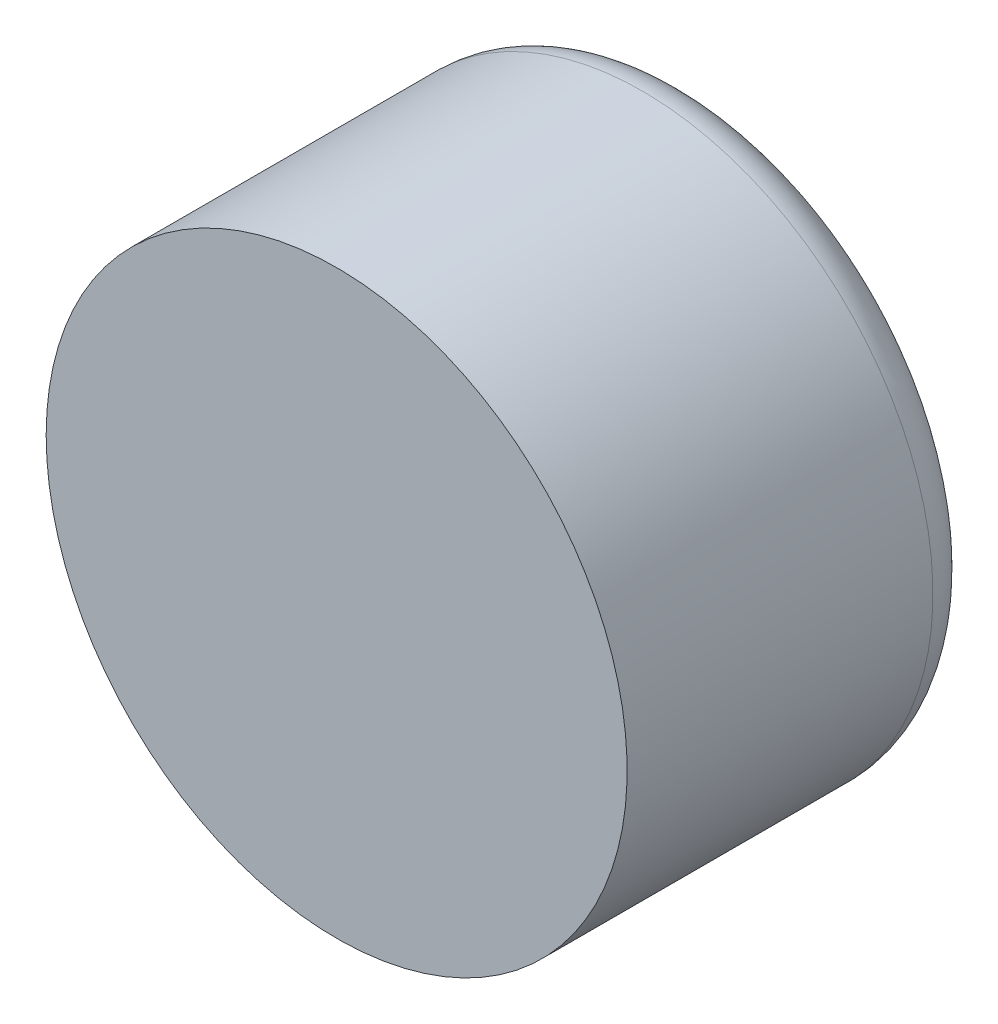
ISO-10303-21;
HEADER;
FILE_DESCRIPTION(('STEP AP214'),'2;1');
FILE_NAME('part.step','',(''),(''),'','','');
FILE_SCHEMA(('AUTOMOTIVE_DESIGN { 1 0 10303 214 1 1 1 1 }'));
ENDSEC;
DATA;
#1=APPLICATION_CONTEXT('core data for automotive mechanical design processes');
#2=APPLICATION_PROTOCOL_DEFINITION('international standard','automotive_design',2000,#1);
#3=PRODUCT_CONTEXT('',#1,'mechanical');
#4=PRODUCT('Part','Part','',(#3));
#5=PRODUCT_RELATED_PRODUCT_CATEGORY('part','',(#4));
#6=PRODUCT_DEFINITION_FORMATION('','',#4);
#7=PRODUCT_DEFINITION_CONTEXT('part definition',#1,'design');
#8=PRODUCT_DEFINITION('design','',#6,#7);
#9=PRODUCT_DEFINITION_SHAPE('','',#8);
#10=(LENGTH_UNIT() NAMED_UNIT(*) SI_UNIT(.MILLI.,.METRE.));
#11=(NAMED_UNIT(*) PLANE_ANGLE_UNIT() SI_UNIT($,.RADIAN.));
#12=(NAMED_UNIT(*) SI_UNIT($,.STERADIAN.) SOLID_ANGLE_UNIT());
#13=UNCERTAINTY_MEASURE_WITH_UNIT(LENGTH_MEASURE(1.E-05),#10,'distance_accuracy_value','');
#14=(GEOMETRIC_REPRESENTATION_CONTEXT(3) GLOBAL_UNCERTAINTY_ASSIGNED_CONTEXT((#13)) GLOBAL_UNIT_ASSIGNED_CONTEXT((#10,
#11,#12)) REPRESENTATION_CONTEXT('',''));
#15=CARTESIAN_POINT('',(0.,0.,0.));
#16=DIRECTION('',(0.,0.,1.));
#17=DIRECTION('',(1.,0.,0.));
#18=AXIS2_PLACEMENT_3D('',#15,#16,#17);
#19=CARTESIAN_POINT('',(3.82033071844035E-09,-9.72969439461125E-07,-9.1));
#20=DIRECTION('',(0.,0.,-1.));
#21=DIRECTION('',(1.,0.,0.));
#22=AXIS2_PLACEMENT_3D('',#19,#20,#21);
#23=TOROIDAL_SURFACE('',#22,1.6,0.3);
#24=CARTESIAN_POINT('',(3.82033071844035E-09,-9.72969439461125E-07,-9.1));
#25=DIRECTION('',(0.,0.,-1.));
#26=DIRECTION('',(-1.,0.,0.));
#27=AXIS2_PLACEMENT_3D('',#24,#25,#26);
#28=CIRCLE('',#27,1.9);
#29=CARTESIAN_POINT('',(-1.89999999617967,-9.72969439693808E-07,-9.1));
#30=VERTEX_POINT('',#29);
#31=EDGE_CURVE('E240',#30,#30,#28,.T.);
#32=ORIENTED_EDGE('',*,*,#31,.T.);
#33=EDGE_LOOP('',(#32));
#34=FACE_BOUND('',#33,.T.);
#35=CARTESIAN_POINT('',(3.82033071844035E-09,-9.72969439461125E-07,-9.4));
#36=DIRECTION('',(0.,0.,1.));
#37=DIRECTION('',(-1.,0.,0.));
#38=AXIS2_PLACEMENT_3D('',#35,#36,#37);
#39=CIRCLE('',#38,1.6);
#40=CARTESIAN_POINT('',(-1.59999999617967,-9.72969439657069E-07,-9.4));
#41=VERTEX_POINT('',#40);
#42=EDGE_CURVE('E11',#41,#41,#39,.T.);
#43=ORIENTED_EDGE('',*,*,#42,.T.);
#44=EDGE_LOOP('',(#43));
#45=FACE_BOUND('',#44,.T.);
#46=ADVANCED_FACE('F17',(#34,#45),#23,.T.);
#47=CARTESIAN_POINT('',(3.82033071844035E-09,-9.72969439461125E-07,-9.4));
#48=DIRECTION('',(0.,0.,1.));
#49=DIRECTION('',(0.,-1.,0.));
#50=AXIS2_PLACEMENT_3D('',#47,#48,#49);
#51=PLANE('',#50);
#52=DIRECTION('',(-0.866025403784438,0.5,0.));
#53=VECTOR('',#52,1.);
#54=CARTESIAN_POINT('',(-0.79999999617967,-0.808291349834916,-9.4));
#55=LINE('',#54,#53);
#56=CARTESIAN_POINT('',(3.8203294862126E-09,-1.27017156518662,-9.4));
#57=VERTEX_POINT('',#56);
#58=CARTESIAN_POINT('',(-1.09999999617967,-0.635086269078028,-9.4));
#59=VERTEX_POINT('',#58);
#60=EDGE_CURVE('E25',#57,#59,#55,.T.);
#61=ORIENTED_EDGE('',*,*,#60,.F.);
#62=DIRECTION('',(-0.866025403784439,-0.5,0.));
#63=VECTOR('',#62,1.);
#64=CARTESIAN_POINT('',(0.30000000382033,-1.09696648442973,-9.4));
#65=LINE('',#64,#63);
#66=CARTESIAN_POINT('',(1.10000000382033,-0.635086269078027,-9.4));
#67=VERTEX_POINT('',#66);
#68=EDGE_CURVE('E43',#67,#57,#65,.T.);
#69=ORIENTED_EDGE('',*,*,#68,.F.);
#70=DIRECTION('',(0.,-1.,0.));
#71=VECTOR('',#70,1.);
#72=CARTESIAN_POINT('',(1.10000000382033,-0.288676107564252,-9.4));
#73=LINE('',#72,#71);
#74=CARTESIAN_POINT('',(1.10000000382033,0.635084323139149,-9.4));
#75=VERTEX_POINT('',#74);
#76=EDGE_CURVE('E122',#75,#67,#73,.T.);
#77=ORIENTED_EDGE('',*,*,#76,.F.);
#78=DIRECTION('',(0.866025403784439,-0.5,0.));
#79=VECTOR('',#78,1.);
#80=CARTESIAN_POINT('',(0.800000003820331,0.808289403896037,-9.4));
#81=LINE('',#80,#79);
#82=CARTESIAN_POINT('',(3.82033097922295E-09,1.27016961924774,-9.4));
#83=VERTEX_POINT('',#82);
#84=EDGE_CURVE('E118',#83,#75,#81,.T.);
#85=ORIENTED_EDGE('',*,*,#84,.F.);
#86=DIRECTION('',(0.866025403784439,0.5,0.));
#87=VECTOR('',#86,1.);
#88=CARTESIAN_POINT('',(-0.299999996179669,1.09696453849085,-9.4));
#89=LINE('',#88,#87);
#90=CARTESIAN_POINT('',(-1.09999999617967,0.635084323139149,-9.4));
#91=VERTEX_POINT('',#90);
#92=EDGE_CURVE('E180',#91,#83,#89,.T.);
#93=ORIENTED_EDGE('',*,*,#92,.F.);
#94=DIRECTION('',(0.,1.,0.));
#95=VECTOR('',#94,1.);
#96=CARTESIAN_POINT('',(-1.09999999617967,0.288674161625374,-9.4));
#97=LINE('',#96,#95);
#98=EDGE_CURVE('E170',#59,#91,#97,.T.);
#99=ORIENTED_EDGE('',*,*,#98,.F.);
#100=EDGE_LOOP('',(#61,#69,#77,#85,#93,#99));
#101=FACE_BOUND('',#100,.T.);
#102=ORIENTED_EDGE('',*,*,#42,.F.);
#103=EDGE_LOOP('',(#102));
#104=FACE_BOUND('',#103,.T.);
#105=ADVANCED_FACE('F275',(#101,#104),#51,.F.);
#106=CARTESIAN_POINT('',(-0.77499999617967,-0.764990079645694,-9.35));
#107=DIRECTION('',(0.353553390593274,0.612372435695794,-0.707106781186548));
#108=DIRECTION('',(-0.894427190999916,0.,-0.447213595499958));
#109=AXIS2_PLACEMENT_3D('',#106,#107,#108);
#110=PLANE('',#109);
#111=ORIENTED_EDGE('',*,*,#60,.T.);
#112=DIRECTION('',(0.654653670707977,0.377964473009227,0.654653670707977));
#113=VECTOR('',#112,1.);
#114=CARTESIAN_POINT('',(-1.09999999617967,-0.635086269078028,-9.4));
#115=LINE('',#114,#113);
#116=CARTESIAN_POINT('',(-0.999999996179669,-0.577351242159065,-9.3));
#117=VERTEX_POINT('',#116);
#118=EDGE_CURVE('E177',#59,#117,#115,.T.);
#119=ORIENTED_EDGE('',*,*,#118,.T.);
#120=DIRECTION('',(0.866025403784438,-0.5,0.));
#121=VECTOR('',#120,1.);
#122=CARTESIAN_POINT('',(-0.74999999617967,-0.721688809456472,-9.3));
#123=LINE('',#122,#121);
#124=CARTESIAN_POINT('',(3.82032955314271E-09,-1.15470151134869,-9.3));
#125=VERTEX_POINT('',#124);
#126=EDGE_CURVE('E166',#117,#125,#123,.T.);
#127=ORIENTED_EDGE('',*,*,#126,.T.);
#128=DIRECTION('',(0.,-0.755928946018455,-0.654653670707977));
#129=VECTOR('',#128,1.);
#130=CARTESIAN_POINT('',(3.82032955314271E-09,-1.15470151134869,-9.3));
#131=LINE('',#130,#129);
#132=EDGE_CURVE('E193',#125,#57,#131,.T.);
#133=ORIENTED_EDGE('',*,*,#132,.T.);
#134=EDGE_LOOP('',(#111,#119,#127,#133));
#135=FACE_BOUND('',#134,.T.);
#136=ADVANCED_FACE('F271',(#135),#110,.T.);
#137=CARTESIAN_POINT('',(0.27500000382033,-1.05366521424051,-9.35));
#138=DIRECTION('',(-0.353553390593274,0.612372435695795,-0.707106781186547));
#139=DIRECTION('',(-0.894427190999916,0.,0.447213595499959));
#140=AXIS2_PLACEMENT_3D('',#137,#138,#139);
#141=PLANE('',#140);
#142=ORIENTED_EDGE('',*,*,#68,.T.);
#143=ORIENTED_EDGE('',*,*,#132,.F.);
#144=DIRECTION('',(0.866025403784439,0.5,0.));
#145=VECTOR('',#144,1.);
#146=CARTESIAN_POINT('',(0.25000000382033,-1.01036394405128,-9.3));
#147=LINE('',#146,#145);
#148=CARTESIAN_POINT('',(1.00000000382033,-0.577351242159065,-9.3));
#149=VERTEX_POINT('',#148);
#150=EDGE_CURVE('E160',#125,#149,#147,.T.);
#151=ORIENTED_EDGE('',*,*,#150,.T.);
#152=DIRECTION('',(-0.654653670707978,0.377964473009226,0.654653670707977));
#153=VECTOR('',#152,1.);
#154=CARTESIAN_POINT('',(1.10000000382033,-0.635086269078027,-9.4));
#155=LINE('',#154,#153);
#156=EDGE_CURVE('E128',#67,#149,#155,.T.);
#157=ORIENTED_EDGE('',*,*,#156,.F.);
#158=EDGE_LOOP('',(#142,#143,#151,#157));
#159=FACE_BOUND('',#158,.T.);
#160=ADVANCED_FACE('F270',(#159),#141,.T.);
#161=CARTESIAN_POINT('',(1.05000000382033,-0.288676107564252,-9.35));
#162=DIRECTION('',(-0.707106781186547,0.,-0.707106781186548));
#163=DIRECTION('',(-0.707106781186548,0.,0.707106781186547));
#164=AXIS2_PLACEMENT_3D('',#161,#162,#163);
#165=PLANE('',#164);
#166=DIRECTION('',(0.,1.,0.));
#167=VECTOR('',#166,1.);
#168=CARTESIAN_POINT('',(1.00000000382033,-0.288676107564252,-9.3));
#169=LINE('',#168,#167);
#170=CARTESIAN_POINT('',(1.00000000382033,0.577349296220187,-9.3));
#171=VERTEX_POINT('',#170);
#172=EDGE_CURVE('E125',#149,#171,#169,.T.);
#173=ORIENTED_EDGE('',*,*,#172,.T.);
#174=DIRECTION('',(-0.654653670707978,-0.377964473009226,0.654653670707977));
#175=VECTOR('',#174,1.);
#176=CARTESIAN_POINT('',(1.10000000382033,0.635084323139149,-9.4));
#177=LINE('',#176,#175);
#178=EDGE_CURVE('E111',#75,#171,#177,.T.);
#179=ORIENTED_EDGE('',*,*,#178,.F.);
#180=ORIENTED_EDGE('',*,*,#76,.T.);
#181=ORIENTED_EDGE('',*,*,#156,.T.);
#182=EDGE_LOOP('',(#173,#179,#180,#181));
#183=FACE_BOUND('',#182,.T.);
#184=ADVANCED_FACE('F127',(#183),#165,.T.);
#185=CARTESIAN_POINT('',(0.775000003820331,0.764988133706815,-9.35));
#186=DIRECTION('',(-0.353553390593274,-0.612372435695794,-0.707106781186548));
#187=DIRECTION('',(0.,-0.755928946018455,0.654653670707977));
#188=AXIS2_PLACEMENT_3D('',#185,#186,#187);
#189=PLANE('',#188);
#190=DIRECTION('',(-0.866025403784439,0.5,0.));
#191=VECTOR('',#190,1.);
#192=CARTESIAN_POINT('',(0.750000003820331,0.721686863517593,-9.3));
#193=LINE('',#192,#191);
#194=CARTESIAN_POINT('',(3.8203306521149E-09,1.15469956540981,-9.3));
#195=VERTEX_POINT('',#194);
#196=EDGE_CURVE('E116',#171,#195,#193,.T.);
#197=ORIENTED_EDGE('',*,*,#196,.T.);
#198=DIRECTION('',(0.,-0.755928946018455,0.654653670707977));
#199=VECTOR('',#198,1.);
#200=CARTESIAN_POINT('',(3.82033097922295E-09,1.27016961924774,-9.4));
#201=LINE('',#200,#199);
#202=EDGE_CURVE('E184',#83,#195,#201,.T.);
#203=ORIENTED_EDGE('',*,*,#202,.F.);
#204=ORIENTED_EDGE('',*,*,#84,.T.);
#205=ORIENTED_EDGE('',*,*,#178,.T.);
#206=EDGE_LOOP('',(#197,#203,#204,#205));
#207=FACE_BOUND('',#206,.T.);
#208=ADVANCED_FACE('F113',(#207),#189,.T.);
#209=CARTESIAN_POINT('',(-0.274999996179669,1.05366326830163,-9.35));
#210=DIRECTION('',(0.353553390593274,-0.612372435695795,-0.707106781186547));
#211=DIRECTION('',(0.,-0.755928946018454,0.654653670707978));
#212=AXIS2_PLACEMENT_3D('',#209,#210,#211);
#213=PLANE('',#212);
#214=ORIENTED_EDGE('',*,*,#92,.T.);
#215=ORIENTED_EDGE('',*,*,#202,.T.);
#216=DIRECTION('',(-0.866025403784439,-0.5,0.));
#217=VECTOR('',#216,1.);
#218=CARTESIAN_POINT('',(-0.249999996179669,1.01036199811241,-9.3));
#219=LINE('',#218,#217);
#220=CARTESIAN_POINT('',(-0.99999999617967,0.577349296220186,-9.3));
#221=VERTEX_POINT('',#220);
#222=EDGE_CURVE('E153',#195,#221,#219,.T.);
#223=ORIENTED_EDGE('',*,*,#222,.T.);
#224=DIRECTION('',(0.654653670707977,-0.377964473009228,0.654653670707977));
#225=VECTOR('',#224,1.);
#226=CARTESIAN_POINT('',(-1.09999999617967,0.635084323139149,-9.4));
#227=LINE('',#226,#225);
#228=EDGE_CURVE('E174',#91,#221,#227,.T.);
#229=ORIENTED_EDGE('',*,*,#228,.F.);
#230=EDGE_LOOP('',(#214,#215,#223,#229));
#231=FACE_BOUND('',#230,.T.);
#232=ADVANCED_FACE('F277',(#231),#213,.T.);
#233=CARTESIAN_POINT('',(-1.04999999617967,0.288674161625374,-9.35));
#234=DIRECTION('',(0.707106781186547,0.,-0.707106781186548));
#235=DIRECTION('',(0.,-1.,0.));
#236=AXIS2_PLACEMENT_3D('',#233,#234,#235);
#237=PLANE('',#236);
#238=ORIENTED_EDGE('',*,*,#98,.T.);
#239=ORIENTED_EDGE('',*,*,#228,.T.);
#240=DIRECTION('',(0.,-1.,0.));
#241=VECTOR('',#240,1.);
#242=CARTESIAN_POINT('',(-0.999999996179669,0.288674161625374,-9.3));
#243=LINE('',#242,#241);
#244=EDGE_CURVE('E207',#221,#117,#243,.T.);
#245=ORIENTED_EDGE('',*,*,#244,.T.);
#246=ORIENTED_EDGE('',*,*,#118,.F.);
#247=EDGE_LOOP('',(#238,#239,#245,#246));
#248=FACE_BOUND('',#247,.T.);
#249=ADVANCED_FACE('F274',(#248),#237,.T.);
#250=CARTESIAN_POINT('',(-0.999999996179669,-0.577351242159065,-9.4));
#251=DIRECTION('',(-0.5,-0.866025403784438,0.));
#252=DIRECTION('',(-0.866025403784438,0.5,0.));
#253=AXIS2_PLACEMENT_3D('',#250,#251,#252);
#254=PLANE('',#253);
#255=ORIENTED_EDGE('',*,*,#126,.F.);
#256=DIRECTION('',(0.,0.,1.));
#257=VECTOR('',#256,1.);
#258=CARTESIAN_POINT('',(-0.999999996179669,-0.577351242159065,-9.4));
#259=LINE('',#258,#257);
#260=CARTESIAN_POINT('',(-0.999999996179669,-0.577351242159065,-7.4));
#261=VERTEX_POINT('',#260);
#262=EDGE_CURVE('E213',#117,#261,#259,.T.);
#263=ORIENTED_EDGE('',*,*,#262,.T.);
#264=DIRECTION('',(0.866025403784438,-0.5,0.));
#265=VECTOR('',#264,1.);
#266=CARTESIAN_POINT('',(-0.999999996179669,-0.577351242159065,-7.4));
#267=LINE('',#266,#265);
#268=CARTESIAN_POINT('',(3.82032955314271E-09,-1.15470151134869,-7.4));
#269=VERTEX_POINT('',#268);
#270=EDGE_CURVE('E230',#261,#269,#267,.T.);
#271=ORIENTED_EDGE('',*,*,#270,.T.);
#272=DIRECTION('',(0.,0.,1.));
#273=VECTOR('',#272,1.);
#274=CARTESIAN_POINT('',(3.82032955314271E-09,-1.15470151134869,-9.4));
#275=LINE('',#274,#273);
#276=EDGE_CURVE('E163',#125,#269,#275,.T.);
#277=ORIENTED_EDGE('',*,*,#276,.F.);
#278=EDGE_LOOP('',(#255,#263,#271,#277));
#279=FACE_BOUND('',#278,.T.);
#280=ADVANCED_FACE('F265',(#279),#254,.F.);
#281=CARTESIAN_POINT('',(3.82032955314271E-09,-1.15470151134869,-9.4));
#282=DIRECTION('',(0.5,-0.866025403784439,0.));
#283=DIRECTION('',(0.,0.,-1.));
#284=AXIS2_PLACEMENT_3D('',#281,#282,#283);
#285=PLANE('',#284);
#286=ORIENTED_EDGE('',*,*,#150,.F.);
#287=ORIENTED_EDGE('',*,*,#276,.T.);
#288=DIRECTION('',(0.866025403784439,0.5,0.));
#289=VECTOR('',#288,1.);
#290=CARTESIAN_POINT('',(3.82032955314271E-09,-1.15470151134869,-7.4));
#291=LINE('',#290,#289);
#292=CARTESIAN_POINT('',(1.00000000382033,-0.577351242159065,-7.4));
#293=VERTEX_POINT('',#292);
#294=EDGE_CURVE('E234',#269,#293,#291,.T.);
#295=ORIENTED_EDGE('',*,*,#294,.T.);
#296=DIRECTION('',(0.,0.,1.));
#297=VECTOR('',#296,1.);
#298=CARTESIAN_POINT('',(1.00000000382033,-0.577351242159065,-9.4));
#299=LINE('',#298,#297);
#300=EDGE_CURVE('E132',#149,#293,#299,.T.);
#301=ORIENTED_EDGE('',*,*,#300,.F.);
#302=EDGE_LOOP('',(#286,#287,#295,#301));
#303=FACE_BOUND('',#302,.T.);
#304=ADVANCED_FACE('F269',(#303),#285,.F.);
#305=CARTESIAN_POINT('',(1.00000000382033,-0.577351242159065,-9.4));
#306=DIRECTION('',(1.,0.,0.));
#307=DIRECTION('',(0.,1.,0.));
#308=AXIS2_PLACEMENT_3D('',#305,#306,#307);
#309=PLANE('',#308);
#310=ORIENTED_EDGE('',*,*,#172,.F.);
#311=ORIENTED_EDGE('',*,*,#300,.T.);
#312=DIRECTION('',(0.,1.,0.));
#313=VECTOR('',#312,1.);
#314=CARTESIAN_POINT('',(1.00000000382033,-0.577351242159065,-7.4));
#315=LINE('',#314,#313);
#316=CARTESIAN_POINT('',(1.00000000382033,0.577349296220187,-7.4));
#317=VERTEX_POINT('',#316);
#318=EDGE_CURVE('E138',#293,#317,#315,.T.);
#319=ORIENTED_EDGE('',*,*,#318,.T.);
#320=DIRECTION('',(0.,0.,1.));
#321=VECTOR('',#320,1.);
#322=CARTESIAN_POINT('',(1.00000000382033,0.577349296220187,-9.4));
#323=LINE('',#322,#321);
#324=EDGE_CURVE('E133',#171,#317,#323,.T.);
#325=ORIENTED_EDGE('',*,*,#324,.F.);
#326=EDGE_LOOP('',(#310,#311,#319,#325));
#327=FACE_BOUND('',#326,.T.);
#328=ADVANCED_FACE('F136',(#327),#309,.F.);
#329=CARTESIAN_POINT('',(1.00000000382033,0.577349296220187,-9.4));
#330=DIRECTION('',(0.5,0.866025403784439,0.));
#331=DIRECTION('',(0.,0.,-1.));
#332=AXIS2_PLACEMENT_3D('',#329,#330,#331);
#333=PLANE('',#332);
#334=ORIENTED_EDGE('',*,*,#196,.F.);
#335=ORIENTED_EDGE('',*,*,#324,.T.);
#336=DIRECTION('',(-0.866025403784439,0.5,0.));
#337=VECTOR('',#336,1.);
#338=CARTESIAN_POINT('',(1.00000000382033,0.577349296220187,-7.4));
#339=LINE('',#338,#337);
#340=CARTESIAN_POINT('',(3.8203306521149E-09,1.15469956540981,-7.4));
#341=VERTEX_POINT('',#340);
#342=EDGE_CURVE('E205',#317,#341,#339,.T.);
#343=ORIENTED_EDGE('',*,*,#342,.T.);
#344=DIRECTION('',(0.,0.,1.));
#345=VECTOR('',#344,1.);
#346=CARTESIAN_POINT('',(3.8203306521149E-09,1.15469956540981,-9.4));
#347=LINE('',#346,#345);
#348=EDGE_CURVE('E145',#195,#341,#347,.T.);
#349=ORIENTED_EDGE('',*,*,#348,.F.);
#350=EDGE_LOOP('',(#334,#335,#343,#349));
#351=FACE_BOUND('',#350,.T.);
#352=ADVANCED_FACE('F144',(#351),#333,.F.);
#353=CARTESIAN_POINT('',(3.8203306521149E-09,1.15469956540981,-9.4));
#354=DIRECTION('',(-0.5,0.866025403784439,0.));
#355=DIRECTION('',(0.,0.,1.));
#356=AXIS2_PLACEMENT_3D('',#353,#354,#355);
#357=PLANE('',#356);
#358=ORIENTED_EDGE('',*,*,#222,.F.);
#359=ORIENTED_EDGE('',*,*,#348,.T.);
#360=DIRECTION('',(-0.866025403784439,-0.5,0.));
#361=VECTOR('',#360,1.);
#362=CARTESIAN_POINT('',(3.8203306521149E-09,1.15469956540981,-7.4));
#363=LINE('',#362,#361);
#364=CARTESIAN_POINT('',(-0.99999999617967,0.577349296220186,-7.4));
#365=VERTEX_POINT('',#364);
#366=EDGE_CURVE('E245',#341,#365,#363,.T.);
#367=ORIENTED_EDGE('',*,*,#366,.T.);
#368=DIRECTION('',(0.,0.,1.));
#369=VECTOR('',#368,1.);
#370=CARTESIAN_POINT('',(-0.99999999617967,0.577349296220186,-9.4));
#371=LINE('',#370,#369);
#372=EDGE_CURVE('E210',#221,#365,#371,.T.);
#373=ORIENTED_EDGE('',*,*,#372,.F.);
#374=EDGE_LOOP('',(#358,#359,#367,#373));
#375=FACE_BOUND('',#374,.T.);
#376=ADVANCED_FACE('F317',(#375),#357,.F.);
#377=CARTESIAN_POINT('',(-0.99999999617967,0.577349296220186,-9.4));
#378=DIRECTION('',(-1.,0.,0.));
#379=DIRECTION('',(0.,0.,1.));
#380=AXIS2_PLACEMENT_3D('',#377,#378,#379);
#381=PLANE('',#380);
#382=ORIENTED_EDGE('',*,*,#244,.F.);
#383=ORIENTED_EDGE('',*,*,#372,.T.);
#384=DIRECTION('',(0.,-1.,0.));
#385=VECTOR('',#384,1.);
#386=CARTESIAN_POINT('',(-0.99999999617967,0.577349296220186,-7.4));
#387=LINE('',#386,#385);
#388=EDGE_CURVE('E233',#365,#261,#387,.T.);
#389=ORIENTED_EDGE('',*,*,#388,.T.);
#390=ORIENTED_EDGE('',*,*,#262,.F.);
#391=EDGE_LOOP('',(#382,#383,#389,#390));
#392=FACE_BOUND('',#391,.T.);
#393=ADVANCED_FACE('F259',(#392),#381,.F.);
#394=CARTESIAN_POINT('',(3.82033038980903E-09,-9.72969439423567E-07,-7.4));
#395=DIRECTION('',(0.,0.,1.));
#396=DIRECTION('',(0.,-1.,0.));
#397=AXIS2_PLACEMENT_3D('',#394,#395,#396);
#398=PLANE('',#397);
#399=ORIENTED_EDGE('',*,*,#294,.F.);
#400=ORIENTED_EDGE('',*,*,#270,.F.);
#401=ORIENTED_EDGE('',*,*,#388,.F.);
#402=ORIENTED_EDGE('',*,*,#366,.F.);
#403=ORIENTED_EDGE('',*,*,#342,.F.);
#404=ORIENTED_EDGE('',*,*,#318,.F.);
#405=EDGE_LOOP('',(#399,#400,#401,#402,#403,#404));
#406=FACE_BOUND('',#405,.T.);
#407=ADVANCED_FACE('F263',(#406),#398,.F.);
#408=CARTESIAN_POINT('',(3.82033071844035E-09,-9.72969439461124E-07,0.599999999999992));
#409=DIRECTION('',(0.,0.,-1.));
#410=DIRECTION('',(-1.,0.,0.));
#411=AXIS2_PLACEMENT_3D('',#408,#409,#410);
#412=CYLINDRICAL_SURFACE('',#411,1.9);
#413=CARTESIAN_POINT('',(3.82033071844035E-09,-9.72969439461125E-07,-7.1));
#414=DIRECTION('',(0.,0.,1.));
#415=DIRECTION('',(-1.,0.,0.));
#416=AXIS2_PLACEMENT_3D('',#413,#414,#415);
#417=CIRCLE('',#416,1.9);
#418=CARTESIAN_POINT('',(-1.89999999617967,-9.72969439693808E-07,-7.1));
#419=VERTEX_POINT('',#418);
#420=EDGE_CURVE('E244',#419,#419,#417,.T.);
#421=ORIENTED_EDGE('',*,*,#420,.F.);
#422=EDGE_LOOP('',(#421));
#423=FACE_BOUND('',#422,.T.);
#424=ORIENTED_EDGE('',*,*,#31,.F.);
#425=EDGE_LOOP('',(#424));
#426=FACE_BOUND('',#425,.T.);
#427=ADVANCED_FACE('F297',(#423,#426),#412,.T.);
#428=CARTESIAN_POINT('',(3.82033071844035E-09,-9.158600344783E-07,-7.1));
#429=DIRECTION('',(0.,0.,1.));
#430=DIRECTION('',(0.,-1.,0.));
#431=AXIS2_PLACEMENT_3D('',#428,#429,#430);
#432=PLANE('',#431);
#433=ORIENTED_EDGE('',*,*,#420,.T.);
#434=EDGE_LOOP('',(#433));
#435=FACE_BOUND('',#434,.T.);
#436=ADVANCED_FACE('F299',(#435),#432,.T.);
#437=CLOSED_SHELL('',(#46,#105,#136,#160,#184,#208,#232,#249,#280,#304,#328,#352,#376,#393,#407,
#427,#436));
#438=MANIFOLD_SOLID_BREP('B1',#437);
#439=ADVANCED_BREP_SHAPE_REPRESENTATION('',(#18,#438),#14);
#440=SHAPE_DEFINITION_REPRESENTATION(#9,#439);
ENDSEC;
END-ISO-10303-21;
